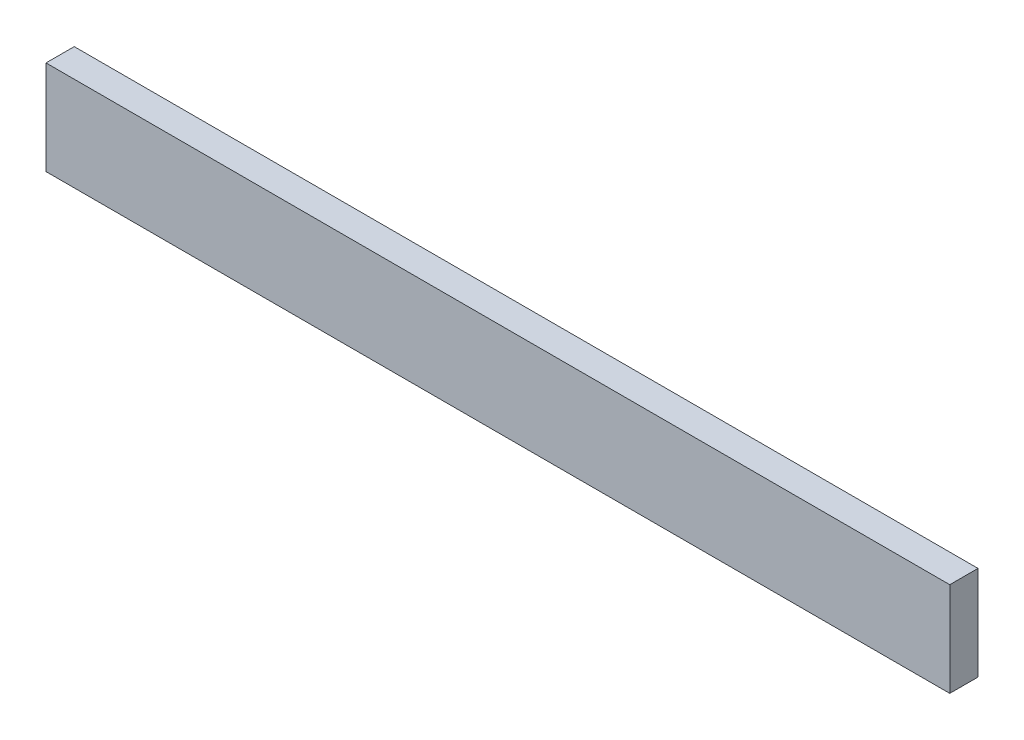
ISO-10303-21;
HEADER;
FILE_DESCRIPTION(('STEP AP214'),'2;1');
FILE_NAME('part.step','',(''),(''),'','','');
FILE_SCHEMA(('AUTOMOTIVE_DESIGN { 1 0 10303 214 1 1 1 1 }'));
ENDSEC;
DATA;
#1=APPLICATION_CONTEXT('core data for automotive mechanical design processes');
#2=APPLICATION_PROTOCOL_DEFINITION('international standard','automotive_design',2000,#1);
#3=PRODUCT_CONTEXT('',#1,'mechanical');
#4=PRODUCT('Part','Part','',(#3));
#5=PRODUCT_RELATED_PRODUCT_CATEGORY('part','',(#4));
#6=PRODUCT_DEFINITION_FORMATION('','',#4);
#7=PRODUCT_DEFINITION_CONTEXT('part definition',#1,'design');
#8=PRODUCT_DEFINITION('design','',#6,#7);
#9=PRODUCT_DEFINITION_SHAPE('','',#8);
#10=(LENGTH_UNIT() NAMED_UNIT(*) SI_UNIT(.MILLI.,.METRE.));
#11=(NAMED_UNIT(*) PLANE_ANGLE_UNIT() SI_UNIT($,.RADIAN.));
#12=(NAMED_UNIT(*) SI_UNIT($,.STERADIAN.) SOLID_ANGLE_UNIT());
#13=UNCERTAINTY_MEASURE_WITH_UNIT(LENGTH_MEASURE(1.E-05),#10,'distance_accuracy_value','');
#14=(GEOMETRIC_REPRESENTATION_CONTEXT(3) GLOBAL_UNCERTAINTY_ASSIGNED_CONTEXT((#13)) GLOBAL_UNIT_ASSIGNED_CONTEXT((#10,
#11,#12)) REPRESENTATION_CONTEXT('',''));
#15=CARTESIAN_POINT('',(0.,0.,0.));
#16=DIRECTION('',(0.,0.,1.));
#17=DIRECTION('',(1.,0.,0.));
#18=AXIS2_PLACEMENT_3D('',#15,#16,#17);
#19=CARTESIAN_POINT('',(-63.1494241087711,-6.67926601150463,3.));
#20=DIRECTION('',(1.,0.,0.));
#21=DIRECTION('',(0.,0.,-1.));
#22=AXIS2_PLACEMENT_3D('',#19,#20,#21);
#23=PLANE('',#22);
#24=DIRECTION('',(0.,-1.,0.));
#25=VECTOR('',#24,1.);
#26=CARTESIAN_POINT('',(-63.1494241087711,-6.67926601150463,0.));
#27=LINE('',#26,#25);
#28=CARTESIAN_POINT('',(-63.1494241087711,3.32073398849537,0.));
#29=VERTEX_POINT('',#28);
#30=CARTESIAN_POINT('',(-63.1494241087711,-6.67926601150463,0.));
#31=VERTEX_POINT('',#30);
#32=EDGE_CURVE('E95',#29,#31,#27,.T.);
#33=ORIENTED_EDGE('',*,*,#32,.T.);
#34=DIRECTION('',(0.,0.,-1.));
#35=VECTOR('',#34,1.);
#36=CARTESIAN_POINT('',(-63.1494241087711,-6.67926601150463,3.));
#37=LINE('',#36,#35);
#38=CARTESIAN_POINT('',(-63.1494241087711,-6.67926601150463,3.));
#39=VERTEX_POINT('',#38);
#40=EDGE_CURVE('E11',#39,#31,#37,.T.);
#41=ORIENTED_EDGE('',*,*,#40,.F.);
#42=DIRECTION('',(0.,-1.,0.));
#43=VECTOR('',#42,1.);
#44=CARTESIAN_POINT('',(-63.1494241087711,-6.67926601150463,3.));
#45=LINE('',#44,#43);
#46=CARTESIAN_POINT('',(-63.1494241087711,3.32073398849537,3.));
#47=VERTEX_POINT('',#46);
#48=EDGE_CURVE('E83',#47,#39,#45,.T.);
#49=ORIENTED_EDGE('',*,*,#48,.F.);
#50=DIRECTION('',(0.,0.,-1.));
#51=VECTOR('',#50,1.);
#52=CARTESIAN_POINT('',(-63.1494241087711,3.32073398849537,3.));
#53=LINE('',#52,#51);
#54=EDGE_CURVE('E91',#47,#29,#53,.T.);
#55=ORIENTED_EDGE('',*,*,#54,.T.);
#56=EDGE_LOOP('',(#33,#41,#49,#55));
#57=FACE_BOUND('',#56,.T.);
#58=ADVANCED_FACE('F32',(#57),#23,.F.);
#59=CARTESIAN_POINT('',(32.8505758912289,-6.67926601150462,3.));
#60=DIRECTION('',(0.,1.,0.));
#61=DIRECTION('',(-1.,0.,0.));
#62=AXIS2_PLACEMENT_3D('',#59,#60,#61);
#63=PLANE('',#62);
#64=DIRECTION('',(1.,0.,0.));
#65=VECTOR('',#64,1.);
#66=CARTESIAN_POINT('',(32.8505758912289,-6.67926601150462,0.));
#67=LINE('',#66,#65);
#68=CARTESIAN_POINT('',(32.8505758912289,-6.67926601150462,0.));
#69=VERTEX_POINT('',#68);
#70=EDGE_CURVE('E87',#31,#69,#67,.T.);
#71=ORIENTED_EDGE('',*,*,#70,.T.);
#72=DIRECTION('',(0.,0.,-1.));
#73=VECTOR('',#72,1.);
#74=CARTESIAN_POINT('',(32.8505758912289,-6.67926601150462,3.));
#75=LINE('',#74,#73);
#76=CARTESIAN_POINT('',(32.8505758912289,-6.67926601150462,3.));
#77=VERTEX_POINT('',#76);
#78=EDGE_CURVE('E40',#77,#69,#75,.T.);
#79=ORIENTED_EDGE('',*,*,#78,.F.);
#80=DIRECTION('',(1.,0.,0.));
#81=VECTOR('',#80,1.);
#82=CARTESIAN_POINT('',(32.8505758912289,-6.67926601150462,3.));
#83=LINE('',#82,#81);
#84=EDGE_CURVE('E78',#39,#77,#83,.T.);
#85=ORIENTED_EDGE('',*,*,#84,.F.);
#86=ORIENTED_EDGE('',*,*,#40,.T.);
#87=EDGE_LOOP('',(#71,#79,#85,#86));
#88=FACE_BOUND('',#87,.T.);
#89=ADVANCED_FACE('F86',(#88),#63,.F.);
#90=CARTESIAN_POINT('',(32.8505758912289,3.32073398849537,3.));
#91=DIRECTION('',(-1.,0.,0.));
#92=DIRECTION('',(0.,0.,1.));
#93=AXIS2_PLACEMENT_3D('',#90,#91,#92);
#94=PLANE('',#93);
#95=DIRECTION('',(0.,1.,0.));
#96=VECTOR('',#95,1.);
#97=CARTESIAN_POINT('',(32.8505758912289,3.32073398849537,0.));
#98=LINE('',#97,#96);
#99=CARTESIAN_POINT('',(32.8505758912289,3.32073398849537,0.));
#100=VERTEX_POINT('',#99);
#101=EDGE_CURVE('E65',#69,#100,#98,.T.);
#102=ORIENTED_EDGE('',*,*,#101,.T.);
#103=DIRECTION('',(0.,0.,-1.));
#104=VECTOR('',#103,1.);
#105=CARTESIAN_POINT('',(32.8505758912289,3.32073398849537,3.));
#106=LINE('',#105,#104);
#107=CARTESIAN_POINT('',(32.8505758912289,3.32073398849537,3.));
#108=VERTEX_POINT('',#107);
#109=EDGE_CURVE('E88',#108,#100,#106,.T.);
#110=ORIENTED_EDGE('',*,*,#109,.F.);
#111=DIRECTION('',(0.,1.,0.));
#112=VECTOR('',#111,1.);
#113=CARTESIAN_POINT('',(32.8505758912289,3.32073398849537,3.));
#114=LINE('',#113,#112);
#115=EDGE_CURVE('E81',#77,#108,#114,.T.);
#116=ORIENTED_EDGE('',*,*,#115,.F.);
#117=ORIENTED_EDGE('',*,*,#78,.T.);
#118=EDGE_LOOP('',(#102,#110,#116,#117));
#119=FACE_BOUND('',#118,.T.);
#120=ADVANCED_FACE('F89',(#119),#94,.F.);
#121=CARTESIAN_POINT('',(-63.1494241087711,3.32073398849537,3.));
#122=DIRECTION('',(0.,-1.,0.));
#123=DIRECTION('',(0.,0.,-1.));
#124=AXIS2_PLACEMENT_3D('',#121,#122,#123);
#125=PLANE('',#124);
#126=DIRECTION('',(-1.,0.,0.));
#127=VECTOR('',#126,1.);
#128=CARTESIAN_POINT('',(-63.1494241087711,3.32073398849537,0.));
#129=LINE('',#128,#127);
#130=EDGE_CURVE('E71',#100,#29,#129,.T.);
#131=ORIENTED_EDGE('',*,*,#130,.T.);
#132=ORIENTED_EDGE('',*,*,#54,.F.);
#133=DIRECTION('',(-1.,0.,0.));
#134=VECTOR('',#133,1.);
#135=CARTESIAN_POINT('',(-63.1494241087711,3.32073398849537,3.));
#136=LINE('',#135,#134);
#137=EDGE_CURVE('E48',#108,#47,#136,.T.);
#138=ORIENTED_EDGE('',*,*,#137,.F.);
#139=ORIENTED_EDGE('',*,*,#109,.T.);
#140=EDGE_LOOP('',(#131,#132,#138,#139));
#141=FACE_BOUND('',#140,.T.);
#142=ADVANCED_FACE('F102',(#141),#125,.F.);
#143=CARTESIAN_POINT('',(0.,0.,3.));
#144=DIRECTION('',(0.,0.,-1.));
#145=DIRECTION('',(-1.,0.,0.));
#146=AXIS2_PLACEMENT_3D('',#143,#144,#145);
#147=PLANE('',#146);
#148=ORIENTED_EDGE('',*,*,#48,.T.);
#149=ORIENTED_EDGE('',*,*,#84,.T.);
#150=ORIENTED_EDGE('',*,*,#115,.T.);
#151=ORIENTED_EDGE('',*,*,#137,.T.);
#152=EDGE_LOOP('',(#148,#149,#150,#151));
#153=FACE_BOUND('',#152,.T.);
#154=ADVANCED_FACE('F79',(#153),#147,.F.);
#155=CARTESIAN_POINT('',(0.,0.,0.));
#156=DIRECTION('',(0.,0.,-1.));
#157=DIRECTION('',(-1.,0.,0.));
#158=AXIS2_PLACEMENT_3D('',#155,#156,#157);
#159=PLANE('',#158);
#160=ORIENTED_EDGE('',*,*,#32,.F.);
#161=ORIENTED_EDGE('',*,*,#130,.F.);
#162=ORIENTED_EDGE('',*,*,#101,.F.);
#163=ORIENTED_EDGE('',*,*,#70,.F.);
#164=EDGE_LOOP('',(#160,#161,#162,#163));
#165=FACE_BOUND('',#164,.T.);
#166=ADVANCED_FACE('F105',(#165),#159,.T.);
#167=CLOSED_SHELL('',(#58,#89,#120,#142,#154,#166));
#168=MANIFOLD_SOLID_BREP('B2',#167);
#169=ADVANCED_BREP_SHAPE_REPRESENTATION('',(#18,#168),#14);
#170=SHAPE_DEFINITION_REPRESENTATION(#9,#169);
ENDSEC;
END-ISO-10303-21;
